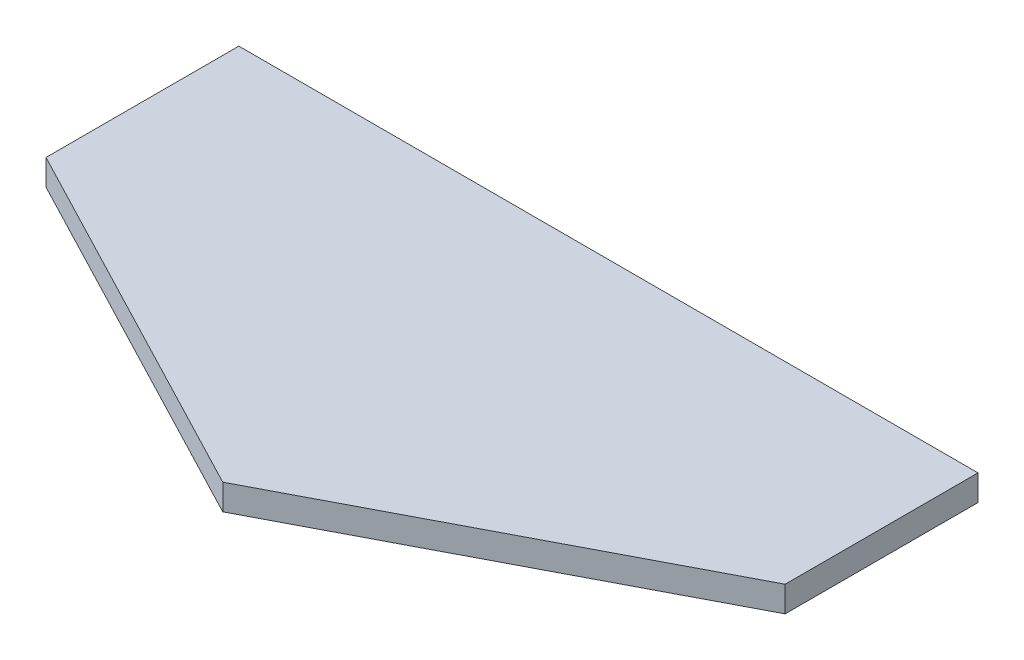
ISO-10303-21;
HEADER;
FILE_DESCRIPTION(('STEP AP214'),'2;1');
FILE_NAME('part.step','',(''),(''),'','','');
FILE_SCHEMA(('AUTOMOTIVE_DESIGN { 1 0 10303 214 1 1 1 1 }'));
ENDSEC;
DATA;
#1=APPLICATION_CONTEXT('core data for automotive mechanical design processes');
#2=APPLICATION_PROTOCOL_DEFINITION('international standard','automotive_design',2000,#1);
#3=PRODUCT_CONTEXT('',#1,'mechanical');
#4=PRODUCT('Part','Part','',(#3));
#5=PRODUCT_RELATED_PRODUCT_CATEGORY('part','',(#4));
#6=PRODUCT_DEFINITION_FORMATION('','',#4);
#7=PRODUCT_DEFINITION_CONTEXT('part definition',#1,'design');
#8=PRODUCT_DEFINITION('design','',#6,#7);
#9=PRODUCT_DEFINITION_SHAPE('','',#8);
#10=(LENGTH_UNIT() NAMED_UNIT(*) SI_UNIT(.MILLI.,.METRE.));
#11=(NAMED_UNIT(*) PLANE_ANGLE_UNIT() SI_UNIT($,.RADIAN.));
#12=(NAMED_UNIT(*) SI_UNIT($,.STERADIAN.) SOLID_ANGLE_UNIT());
#13=UNCERTAINTY_MEASURE_WITH_UNIT(LENGTH_MEASURE(1.E-05),#10,'distance_accuracy_value','');
#14=(GEOMETRIC_REPRESENTATION_CONTEXT(3) GLOBAL_UNCERTAINTY_ASSIGNED_CONTEXT((#13)) GLOBAL_UNIT_ASSIGNED_CONTEXT((#10,
#11,#12)) REPRESENTATION_CONTEXT('',''));
#15=CARTESIAN_POINT('',(0.,0.,0.));
#16=DIRECTION('',(0.,0.,1.));
#17=DIRECTION('',(1.,0.,0.));
#18=AXIS2_PLACEMENT_3D('',#15,#16,#17);
#19=CARTESIAN_POINT('',(36.9093610698365,4.,70.74294205052));
#20=DIRECTION('',(-0.46256600669502,0.,-0.886584846165455));
#21=DIRECTION('',(-0.886584846165455,0.,0.46256600669502));
#22=AXIS2_PLACEMENT_3D('',#19,#20,#21);
#23=PLANE('',#22);
#24=DIRECTION('',(0.886584846165455,0.,-0.46256600669502));
#25=VECTOR('',#24,1.);
#26=CARTESIAN_POINT('',(36.9093610698365,0.,70.74294205052));
#27=LINE('',#26,#25);
#28=CARTESIAN_POINT('',(57.5,0.,60.));
#29=VERTEX_POINT('',#28);
#30=CARTESIAN_POINT('',(115.,0.,30.));
#31=VERTEX_POINT('',#30);
#32=EDGE_CURVE('E110',#29,#31,#27,.T.);
#33=ORIENTED_EDGE('',*,*,#32,.T.);
#34=DIRECTION('',(0.,-1.,0.));
#35=VECTOR('',#34,1.);
#36=CARTESIAN_POINT('',(115.,4.,30.));
#37=LINE('',#36,#35);
#38=CARTESIAN_POINT('',(115.,4.,30.));
#39=VERTEX_POINT('',#38);
#40=EDGE_CURVE('E11',#39,#31,#37,.T.);
#41=ORIENTED_EDGE('',*,*,#40,.F.);
#42=DIRECTION('',(0.886584846165455,0.,-0.46256600669502));
#43=VECTOR('',#42,1.);
#44=CARTESIAN_POINT('',(36.9093610698365,4.,70.74294205052));
#45=LINE('',#44,#43);
#46=CARTESIAN_POINT('',(57.5,4.,60.));
#47=VERTEX_POINT('',#46);
#48=EDGE_CURVE('E81',#47,#39,#45,.T.);
#49=ORIENTED_EDGE('',*,*,#48,.F.);
#50=DIRECTION('',(0.,-1.,0.));
#51=VECTOR('',#50,1.);
#52=CARTESIAN_POINT('',(57.5,4.,60.));
#53=LINE('',#52,#51);
#54=EDGE_CURVE('E109',#47,#29,#53,.T.);
#55=ORIENTED_EDGE('',*,*,#54,.T.);
#56=EDGE_LOOP('',(#33,#41,#49,#55));
#57=FACE_BOUND('',#56,.T.);
#58=ADVANCED_FACE('F35',(#57),#23,.F.);
#59=CARTESIAN_POINT('',(115.,4.,0.));
#60=DIRECTION('',(1.,0.,0.));
#61=DIRECTION('',(0.,0.,-1.));
#62=AXIS2_PLACEMENT_3D('',#59,#60,#61);
#63=PLANE('',#62);
#64=DIRECTION('',(0.,0.,1.));
#65=VECTOR('',#64,1.);
#66=CARTESIAN_POINT('',(115.,0.,0.));
#67=LINE('',#66,#65);
#68=CARTESIAN_POINT('',(115.,0.,0.));
#69=VERTEX_POINT('',#68);
#70=EDGE_CURVE('E113',#69,#31,#67,.T.);
#71=ORIENTED_EDGE('',*,*,#70,.F.);
#72=DIRECTION('',(0.,-1.,0.));
#73=VECTOR('',#72,1.);
#74=CARTESIAN_POINT('',(115.,4.,0.));
#75=LINE('',#74,#73);
#76=CARTESIAN_POINT('',(115.,4.,0.));
#77=VERTEX_POINT('',#76);
#78=EDGE_CURVE('E43',#77,#69,#75,.T.);
#79=ORIENTED_EDGE('',*,*,#78,.F.);
#80=DIRECTION('',(0.,0.,1.));
#81=VECTOR('',#80,1.);
#82=CARTESIAN_POINT('',(115.,4.,0.));
#83=LINE('',#82,#81);
#84=EDGE_CURVE('E103',#77,#39,#83,.T.);
#85=ORIENTED_EDGE('',*,*,#84,.T.);
#86=ORIENTED_EDGE('',*,*,#40,.T.);
#87=EDGE_LOOP('',(#71,#79,#85,#86));
#88=FACE_BOUND('',#87,.T.);
#89=ADVANCED_FACE('F122',(#88),#63,.T.);
#90=CARTESIAN_POINT('',(0.,4.,0.));
#91=DIRECTION('',(0.,0.,-1.));
#92=DIRECTION('',(-1.,0.,0.));
#93=AXIS2_PLACEMENT_3D('',#90,#91,#92);
#94=PLANE('',#93);
#95=DIRECTION('',(1.,0.,0.));
#96=VECTOR('',#95,1.);
#97=CARTESIAN_POINT('',(0.,0.,0.));
#98=LINE('',#97,#96);
#99=CARTESIAN_POINT('',(0.,0.,0.));
#100=VERTEX_POINT('',#99);
#101=EDGE_CURVE('E95',#100,#69,#98,.T.);
#102=ORIENTED_EDGE('',*,*,#101,.F.);
#103=DIRECTION('',(0.,-1.,0.));
#104=VECTOR('',#103,1.);
#105=CARTESIAN_POINT('',(0.,4.,0.));
#106=LINE('',#105,#104);
#107=CARTESIAN_POINT('',(0.,4.,0.));
#108=VERTEX_POINT('',#107);
#109=EDGE_CURVE('E89',#108,#100,#106,.T.);
#110=ORIENTED_EDGE('',*,*,#109,.F.);
#111=DIRECTION('',(1.,0.,0.));
#112=VECTOR('',#111,1.);
#113=CARTESIAN_POINT('',(0.,4.,0.));
#114=LINE('',#113,#112);
#115=EDGE_CURVE('E93',#108,#77,#114,.T.);
#116=ORIENTED_EDGE('',*,*,#115,.T.);
#117=ORIENTED_EDGE('',*,*,#78,.T.);
#118=EDGE_LOOP('',(#102,#110,#116,#117));
#119=FACE_BOUND('',#118,.T.);
#120=ADVANCED_FACE('F91',(#119),#94,.T.);
#121=CARTESIAN_POINT('',(0.,4.,0.));
#122=DIRECTION('',(1.,0.,0.));
#123=DIRECTION('',(0.,0.,-1.));
#124=AXIS2_PLACEMENT_3D('',#121,#122,#123);
#125=PLANE('',#124);
#126=DIRECTION('',(0.,0.,1.));
#127=VECTOR('',#126,1.);
#128=CARTESIAN_POINT('',(0.,0.,0.));
#129=LINE('',#128,#127);
#130=CARTESIAN_POINT('',(0.,0.,30.));
#131=VERTEX_POINT('',#130);
#132=EDGE_CURVE('E69',#100,#131,#129,.T.);
#133=ORIENTED_EDGE('',*,*,#132,.T.);
#134=DIRECTION('',(0.,-1.,0.));
#135=VECTOR('',#134,1.);
#136=CARTESIAN_POINT('',(0.,4.,30.));
#137=LINE('',#136,#135);
#138=CARTESIAN_POINT('',(0.,4.,30.));
#139=VERTEX_POINT('',#138);
#140=EDGE_CURVE('E96',#139,#131,#137,.T.);
#141=ORIENTED_EDGE('',*,*,#140,.F.);
#142=DIRECTION('',(0.,0.,1.));
#143=VECTOR('',#142,1.);
#144=CARTESIAN_POINT('',(0.,4.,0.));
#145=LINE('',#144,#143);
#146=EDGE_CURVE('E98',#108,#139,#145,.T.);
#147=ORIENTED_EDGE('',*,*,#146,.F.);
#148=ORIENTED_EDGE('',*,*,#109,.T.);
#149=EDGE_LOOP('',(#133,#141,#147,#148));
#150=FACE_BOUND('',#149,.T.);
#151=ADVANCED_FACE('F99',(#150),#125,.F.);
#152=CARTESIAN_POINT('',(-12.3031203566122,4.,23.5809806835067));
#153=DIRECTION('',(0.46256600669502,0.,-0.886584846165455));
#154=DIRECTION('',(-0.886584846165455,0.,-0.46256600669502));
#155=AXIS2_PLACEMENT_3D('',#152,#153,#154);
#156=PLANE('',#155);
#157=DIRECTION('',(0.886584846165455,0.,0.46256600669502));
#158=VECTOR('',#157,1.);
#159=CARTESIAN_POINT('',(-12.3031203566122,0.,23.5809806835067));
#160=LINE('',#159,#158);
#161=EDGE_CURVE('E75',#131,#29,#160,.T.);
#162=ORIENTED_EDGE('',*,*,#161,.T.);
#163=ORIENTED_EDGE('',*,*,#54,.F.);
#164=DIRECTION('',(0.886584846165455,0.,0.46256600669502));
#165=VECTOR('',#164,1.);
#166=CARTESIAN_POINT('',(-12.3031203566122,4.,23.5809806835067));
#167=LINE('',#166,#165);
#168=EDGE_CURVE('E51',#139,#47,#167,.T.);
#169=ORIENTED_EDGE('',*,*,#168,.F.);
#170=ORIENTED_EDGE('',*,*,#140,.T.);
#171=EDGE_LOOP('',(#162,#163,#169,#170));
#172=FACE_BOUND('',#171,.T.);
#173=ADVANCED_FACE('F127',(#172),#156,.F.);
#174=CARTESIAN_POINT('',(0.,4.,0.));
#175=DIRECTION('',(0.,1.,0.));
#176=DIRECTION('',(0.,0.,1.));
#177=AXIS2_PLACEMENT_3D('',#174,#175,#176);
#178=PLANE('',#177);
#179=ORIENTED_EDGE('',*,*,#48,.T.);
#180=ORIENTED_EDGE('',*,*,#84,.F.);
#181=ORIENTED_EDGE('',*,*,#115,.F.);
#182=ORIENTED_EDGE('',*,*,#146,.T.);
#183=ORIENTED_EDGE('',*,*,#168,.T.);
#184=EDGE_LOOP('',(#179,#180,#181,#182,#183));
#185=FACE_BOUND('',#184,.T.);
#186=ADVANCED_FACE('F101',(#185),#178,.T.);
#187=CARTESIAN_POINT('',(0.,0.,0.));
#188=DIRECTION('',(0.,1.,0.));
#189=DIRECTION('',(0.,0.,1.));
#190=AXIS2_PLACEMENT_3D('',#187,#188,#189);
#191=PLANE('',#190);
#192=ORIENTED_EDGE('',*,*,#32,.F.);
#193=ORIENTED_EDGE('',*,*,#161,.F.);
#194=ORIENTED_EDGE('',*,*,#132,.F.);
#195=ORIENTED_EDGE('',*,*,#101,.T.);
#196=ORIENTED_EDGE('',*,*,#70,.T.);
#197=EDGE_LOOP('',(#192,#193,#194,#195,#196));
#198=FACE_BOUND('',#197,.T.);
#199=ADVANCED_FACE('F125',(#198),#191,.F.);
#200=CLOSED_SHELL('',(#58,#89,#120,#151,#173,#186,#199));
#201=MANIFOLD_SOLID_BREP('B2',#200);
#202=ADVANCED_BREP_SHAPE_REPRESENTATION('',(#18,#201),#14);
#203=SHAPE_DEFINITION_REPRESENTATION(#9,#202);
ENDSEC;
END-ISO-10303-21;
